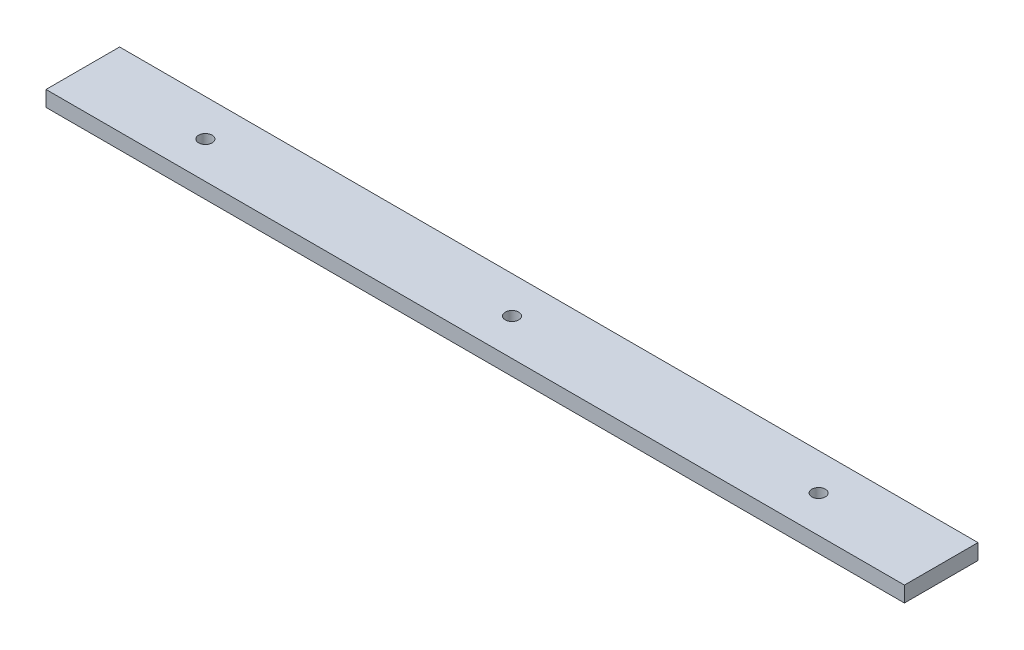
ISO-10303-21;
HEADER;
FILE_DESCRIPTION(('STEP AP214'),'2;1');
FILE_NAME('part.step','',(''),(''),'','','');
FILE_SCHEMA(('AUTOMOTIVE_DESIGN { 1 0 10303 214 1 1 1 1 }'));
ENDSEC;
DATA;
#1=APPLICATION_CONTEXT('core data for automotive mechanical design processes');
#2=APPLICATION_PROTOCOL_DEFINITION('international standard','automotive_design',2000,#1);
#3=PRODUCT_CONTEXT('',#1,'mechanical');
#4=PRODUCT('Part','Part','',(#3));
#5=PRODUCT_RELATED_PRODUCT_CATEGORY('part','',(#4));
#6=PRODUCT_DEFINITION_FORMATION('','',#4);
#7=PRODUCT_DEFINITION_CONTEXT('part definition',#1,'design');
#8=PRODUCT_DEFINITION('design','',#6,#7);
#9=PRODUCT_DEFINITION_SHAPE('','',#8);
#10=(LENGTH_UNIT() NAMED_UNIT(*) SI_UNIT(.MILLI.,.METRE.));
#11=(NAMED_UNIT(*) PLANE_ANGLE_UNIT() SI_UNIT($,.RADIAN.));
#12=(NAMED_UNIT(*) SI_UNIT($,.STERADIAN.) SOLID_ANGLE_UNIT());
#13=UNCERTAINTY_MEASURE_WITH_UNIT(LENGTH_MEASURE(1.E-05),#10,'distance_accuracy_value','');
#14=(GEOMETRIC_REPRESENTATION_CONTEXT(3) GLOBAL_UNCERTAINTY_ASSIGNED_CONTEXT((#13)) GLOBAL_UNIT_ASSIGNED_CONTEXT((#10,
#11,#12)) REPRESENTATION_CONTEXT('',''));
#15=CARTESIAN_POINT('',(0.,0.,0.));
#16=DIRECTION('',(0.,0.,1.));
#17=DIRECTION('',(1.,0.,0.));
#18=AXIS2_PLACEMENT_3D('',#15,#16,#17);
#19=CARTESIAN_POINT('',(0.,6.35,0.));
#20=DIRECTION('',(0.,-1.,0.));
#21=DIRECTION('',(0.,0.,-1.));
#22=AXIS2_PLACEMENT_3D('',#19,#20,#21);
#23=PLANE('',#22);
#24=CARTESIAN_POINT('',(50.,6.35,-15.));
#25=DIRECTION('',(0.,1.,0.));
#26=DIRECTION('',(0.,0.,1.));
#27=AXIS2_PLACEMENT_3D('',#24,#25,#26);
#28=CIRCLE('',#27,2.75);
#29=CARTESIAN_POINT('',(50.,6.35,-12.25));
#30=VERTEX_POINT('',#29);
#31=EDGE_CURVE('E154',#30,#30,#28,.T.);
#32=ORIENTED_EDGE('',*,*,#31,.F.);
#33=EDGE_LOOP('',(#32));
#34=FACE_BOUND('',#33,.T.);
#35=CARTESIAN_POINT('',(175.,6.35,-15.));
#36=DIRECTION('',(0.,1.,0.));
#37=DIRECTION('',(0.,0.,1.));
#38=AXIS2_PLACEMENT_3D('',#35,#36,#37);
#39=CIRCLE('',#38,2.75);
#40=CARTESIAN_POINT('',(175.,6.35,-12.25));
#41=VERTEX_POINT('',#40);
#42=EDGE_CURVE('E146',#41,#41,#39,.T.);
#43=ORIENTED_EDGE('',*,*,#42,.F.);
#44=EDGE_LOOP('',(#43));
#45=FACE_BOUND('',#44,.T.);
#46=DIRECTION('',(0.,0.,1.));
#47=VECTOR('',#46,1.);
#48=CARTESIAN_POINT('',(0.,6.35,0.));
#49=LINE('',#48,#47);
#50=CARTESIAN_POINT('',(0.,6.35,-30.));
#51=VERTEX_POINT('',#50);
#52=CARTESIAN_POINT('',(0.,6.35,0.));
#53=VERTEX_POINT('',#52);
#54=EDGE_CURVE('E98',#51,#53,#49,.T.);
#55=ORIENTED_EDGE('',*,*,#54,.T.);
#56=DIRECTION('',(1.,0.,0.));
#57=VECTOR('',#56,1.);
#58=CARTESIAN_POINT('',(0.,6.35,0.));
#59=LINE('',#58,#57);
#60=CARTESIAN_POINT('',(350.,6.35,0.));
#61=VERTEX_POINT('',#60);
#62=EDGE_CURVE('E93',#53,#61,#59,.T.);
#63=ORIENTED_EDGE('',*,*,#62,.T.);
#64=DIRECTION('',(0.,0.,-1.));
#65=VECTOR('',#64,1.);
#66=CARTESIAN_POINT('',(350.,6.35,0.));
#67=LINE('',#66,#65);
#68=CARTESIAN_POINT('',(350.,6.35,-30.));
#69=VERTEX_POINT('',#68);
#70=EDGE_CURVE('E96',#61,#69,#67,.T.);
#71=ORIENTED_EDGE('',*,*,#70,.T.);
#72=DIRECTION('',(-1.,0.,0.));
#73=VECTOR('',#72,1.);
#74=CARTESIAN_POINT('',(0.,6.35,-30.));
#75=LINE('',#74,#73);
#76=EDGE_CURVE('E63',#69,#51,#75,.T.);
#77=ORIENTED_EDGE('',*,*,#76,.T.);
#78=EDGE_LOOP('',(#55,#63,#71,#77));
#79=FACE_BOUND('',#78,.T.);
#80=CARTESIAN_POINT('',(300.,6.35,-15.));
#81=DIRECTION('',(0.,1.,0.));
#82=DIRECTION('',(0.,0.,1.));
#83=AXIS2_PLACEMENT_3D('',#80,#81,#82);
#84=CIRCLE('',#83,2.74999999999997);
#85=CARTESIAN_POINT('',(300.,6.35,-12.25));
#86=VERTEX_POINT('',#85);
#87=EDGE_CURVE('E138',#86,#86,#84,.T.);
#88=ORIENTED_EDGE('',*,*,#87,.F.);
#89=EDGE_LOOP('',(#88));
#90=FACE_BOUND('',#89,.T.);
#91=ADVANCED_FACE('F45',(#34,#45,#79,#90),#23,.F.);
#92=CARTESIAN_POINT('',(0.,6.35,0.));
#93=DIRECTION('',(1.,0.,0.));
#94=DIRECTION('',(0.,0.,-1.));
#95=AXIS2_PLACEMENT_3D('',#92,#93,#94);
#96=PLANE('',#95);
#97=DIRECTION('',(0.,0.,1.));
#98=VECTOR('',#97,1.);
#99=CARTESIAN_POINT('',(0.,0.,0.));
#100=LINE('',#99,#98);
#101=CARTESIAN_POINT('',(0.,0.,-30.));
#102=VERTEX_POINT('',#101);
#103=CARTESIAN_POINT('',(0.,0.,0.));
#104=VERTEX_POINT('',#103);
#105=EDGE_CURVE('E114',#102,#104,#100,.T.);
#106=ORIENTED_EDGE('',*,*,#105,.T.);
#107=DIRECTION('',(0.,-1.,0.));
#108=VECTOR('',#107,1.);
#109=CARTESIAN_POINT('',(0.,6.35,0.));
#110=LINE('',#109,#108);
#111=EDGE_CURVE('E11',#53,#104,#110,.T.);
#112=ORIENTED_EDGE('',*,*,#111,.F.);
#113=ORIENTED_EDGE('',*,*,#54,.F.);
#114=DIRECTION('',(0.,-1.,0.));
#115=VECTOR('',#114,1.);
#116=CARTESIAN_POINT('',(0.,6.35,-30.));
#117=LINE('',#116,#115);
#118=EDGE_CURVE('E110',#51,#102,#117,.T.);
#119=ORIENTED_EDGE('',*,*,#118,.T.);
#120=EDGE_LOOP('',(#106,#112,#113,#119));
#121=FACE_BOUND('',#120,.T.);
#122=ADVANCED_FACE('F47',(#121),#96,.F.);
#123=CARTESIAN_POINT('',(0.,6.35,0.));
#124=DIRECTION('',(0.,0.,-1.));
#125=DIRECTION('',(-1.,0.,0.));
#126=AXIS2_PLACEMENT_3D('',#123,#124,#125);
#127=PLANE('',#126);
#128=DIRECTION('',(1.,0.,0.));
#129=VECTOR('',#128,1.);
#130=CARTESIAN_POINT('',(0.,0.,0.));
#131=LINE('',#130,#129);
#132=CARTESIAN_POINT('',(350.,0.,0.));
#133=VERTEX_POINT('',#132);
#134=EDGE_CURVE('E103',#104,#133,#131,.T.);
#135=ORIENTED_EDGE('',*,*,#134,.T.);
#136=DIRECTION('',(0.,-1.,0.));
#137=VECTOR('',#136,1.);
#138=CARTESIAN_POINT('',(350.,6.35,0.));
#139=LINE('',#138,#137);
#140=EDGE_CURVE('E55',#61,#133,#139,.T.);
#141=ORIENTED_EDGE('',*,*,#140,.F.);
#142=ORIENTED_EDGE('',*,*,#62,.F.);
#143=ORIENTED_EDGE('',*,*,#111,.T.);
#144=EDGE_LOOP('',(#135,#141,#142,#143));
#145=FACE_BOUND('',#144,.T.);
#146=ADVANCED_FACE('F102',(#145),#127,.F.);
#147=CARTESIAN_POINT('',(350.,6.35,0.));
#148=DIRECTION('',(-1.,0.,0.));
#149=DIRECTION('',(0.,0.,1.));
#150=AXIS2_PLACEMENT_3D('',#147,#148,#149);
#151=PLANE('',#150);
#152=DIRECTION('',(0.,0.,-1.));
#153=VECTOR('',#152,1.);
#154=CARTESIAN_POINT('',(350.,0.,0.));
#155=LINE('',#154,#153);
#156=CARTESIAN_POINT('',(350.,0.,-30.));
#157=VERTEX_POINT('',#156);
#158=EDGE_CURVE('E80',#133,#157,#155,.T.);
#159=ORIENTED_EDGE('',*,*,#158,.T.);
#160=DIRECTION('',(0.,-1.,0.));
#161=VECTOR('',#160,1.);
#162=CARTESIAN_POINT('',(350.,6.35,-30.));
#163=LINE('',#162,#161);
#164=EDGE_CURVE('E105',#69,#157,#163,.T.);
#165=ORIENTED_EDGE('',*,*,#164,.F.);
#166=ORIENTED_EDGE('',*,*,#70,.F.);
#167=ORIENTED_EDGE('',*,*,#140,.T.);
#168=EDGE_LOOP('',(#159,#165,#166,#167));
#169=FACE_BOUND('',#168,.T.);
#170=ADVANCED_FACE('F106',(#169),#151,.F.);
#171=CARTESIAN_POINT('',(0.,6.35,-30.));
#172=DIRECTION('',(0.,0.,1.));
#173=DIRECTION('',(1.,0.,0.));
#174=AXIS2_PLACEMENT_3D('',#171,#172,#173);
#175=PLANE('',#174);
#176=DIRECTION('',(-1.,0.,0.));
#177=VECTOR('',#176,1.);
#178=CARTESIAN_POINT('',(0.,0.,-30.));
#179=LINE('',#178,#177);
#180=EDGE_CURVE('E86',#157,#102,#179,.T.);
#181=ORIENTED_EDGE('',*,*,#180,.T.);
#182=ORIENTED_EDGE('',*,*,#118,.F.);
#183=ORIENTED_EDGE('',*,*,#76,.F.);
#184=ORIENTED_EDGE('',*,*,#164,.T.);
#185=EDGE_LOOP('',(#181,#182,#183,#184));
#186=FACE_BOUND('',#185,.T.);
#187=ADVANCED_FACE('F128',(#186),#175,.F.);
#188=CARTESIAN_POINT('',(0.,0.,0.));
#189=DIRECTION('',(0.,-1.,0.));
#190=DIRECTION('',(0.,0.,-1.));
#191=AXIS2_PLACEMENT_3D('',#188,#189,#190);
#192=PLANE('',#191);
#193=CARTESIAN_POINT('',(50.,0.,-15.));
#194=DIRECTION('',(0.,1.,0.));
#195=DIRECTION('',(0.,0.,1.));
#196=AXIS2_PLACEMENT_3D('',#193,#194,#195);
#197=CIRCLE('',#196,2.75);
#198=CARTESIAN_POINT('',(50.,0.,-12.25));
#199=VERTEX_POINT('',#198);
#200=EDGE_CURVE('E150',#199,#199,#197,.T.);
#201=ORIENTED_EDGE('',*,*,#200,.T.);
#202=EDGE_LOOP('',(#201));
#203=FACE_BOUND('',#202,.T.);
#204=CARTESIAN_POINT('',(175.,0.,-15.));
#205=DIRECTION('',(0.,1.,0.));
#206=DIRECTION('',(0.,0.,1.));
#207=AXIS2_PLACEMENT_3D('',#204,#205,#206);
#208=CIRCLE('',#207,2.75);
#209=CARTESIAN_POINT('',(175.,0.,-12.25));
#210=VERTEX_POINT('',#209);
#211=EDGE_CURVE('E142',#210,#210,#208,.T.);
#212=ORIENTED_EDGE('',*,*,#211,.T.);
#213=EDGE_LOOP('',(#212));
#214=FACE_BOUND('',#213,.T.);
#215=CARTESIAN_POINT('',(300.,0.,-15.));
#216=DIRECTION('',(0.,1.,0.));
#217=DIRECTION('',(0.,0.,1.));
#218=AXIS2_PLACEMENT_3D('',#215,#216,#217);
#219=CIRCLE('',#218,2.74999999999997);
#220=CARTESIAN_POINT('',(300.,0.,-12.25));
#221=VERTEX_POINT('',#220);
#222=EDGE_CURVE('E118',#221,#221,#219,.T.);
#223=ORIENTED_EDGE('',*,*,#222,.T.);
#224=EDGE_LOOP('',(#223));
#225=FACE_BOUND('',#224,.T.);
#226=ORIENTED_EDGE('',*,*,#105,.F.);
#227=ORIENTED_EDGE('',*,*,#180,.F.);
#228=ORIENTED_EDGE('',*,*,#158,.F.);
#229=ORIENTED_EDGE('',*,*,#134,.F.);
#230=EDGE_LOOP('',(#226,#227,#228,#229));
#231=FACE_BOUND('',#230,.T.);
#232=ADVANCED_FACE('F131',(#203,#214,#225,#231),#192,.T.);
#233=CARTESIAN_POINT('',(300.,6.35,-15.));
#234=DIRECTION('',(0.,1.,0.));
#235=DIRECTION('',(0.,0.,1.));
#236=AXIS2_PLACEMENT_3D('',#233,#234,#235);
#237=CYLINDRICAL_SURFACE('',#236,2.74999999999997);
#238=ORIENTED_EDGE('',*,*,#222,.F.);
#239=EDGE_LOOP('',(#238));
#240=FACE_BOUND('',#239,.T.);
#241=ORIENTED_EDGE('',*,*,#87,.T.);
#242=EDGE_LOOP('',(#241));
#243=FACE_BOUND('',#242,.T.);
#244=ADVANCED_FACE('F168',(#240,#243),#237,.F.);
#245=CARTESIAN_POINT('',(175.,6.35,-15.));
#246=DIRECTION('',(0.,1.,0.));
#247=DIRECTION('',(0.,0.,1.));
#248=AXIS2_PLACEMENT_3D('',#245,#246,#247);
#249=CYLINDRICAL_SURFACE('',#248,2.75);
#250=ORIENTED_EDGE('',*,*,#211,.F.);
#251=EDGE_LOOP('',(#250));
#252=FACE_BOUND('',#251,.T.);
#253=ORIENTED_EDGE('',*,*,#42,.T.);
#254=EDGE_LOOP('',(#253));
#255=FACE_BOUND('',#254,.T.);
#256=ADVANCED_FACE('F166',(#252,#255),#249,.F.);
#257=CARTESIAN_POINT('',(50.,6.35,-15.));
#258=DIRECTION('',(0.,1.,0.));
#259=DIRECTION('',(0.,0.,1.));
#260=AXIS2_PLACEMENT_3D('',#257,#258,#259);
#261=CYLINDRICAL_SURFACE('',#260,2.75);
#262=ORIENTED_EDGE('',*,*,#200,.F.);
#263=EDGE_LOOP('',(#262));
#264=FACE_BOUND('',#263,.T.);
#265=ORIENTED_EDGE('',*,*,#31,.T.);
#266=EDGE_LOOP('',(#265));
#267=FACE_BOUND('',#266,.T.);
#268=ADVANCED_FACE('F159',(#264,#267),#261,.F.);
#269=CLOSED_SHELL('',(#91,#122,#146,#170,#187,#232,#244,#256,#268));
#270=MANIFOLD_SOLID_BREP('B2',#269);
#271=ADVANCED_BREP_SHAPE_REPRESENTATION('',(#18,#270),#14);
#272=SHAPE_DEFINITION_REPRESENTATION(#9,#271);
ENDSEC;
END-ISO-10303-21;
